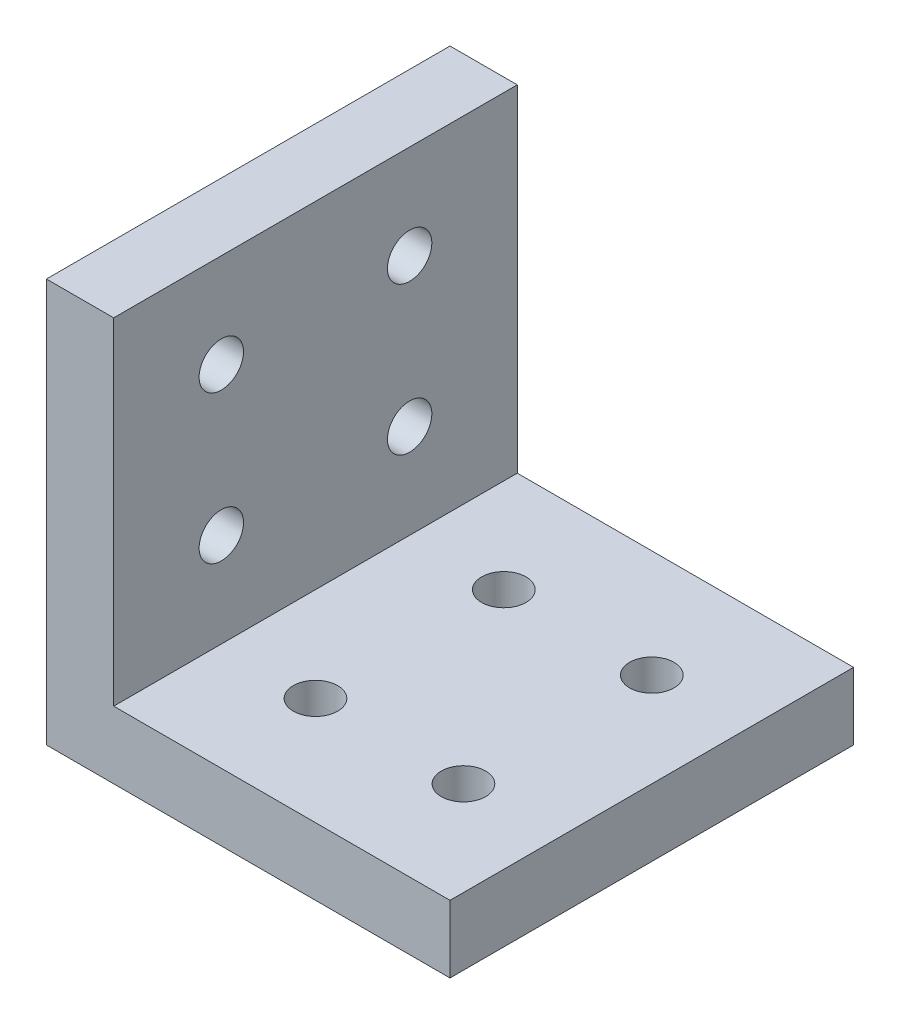
ISO-10303-21;
HEADER;
FILE_DESCRIPTION(('STEP AP214'),'2;1');
FILE_NAME('part.step','',(''),(''),'','','');
FILE_SCHEMA(('AUTOMOTIVE_DESIGN { 1 0 10303 214 1 1 1 1 }'));
ENDSEC;
DATA;
#1=APPLICATION_CONTEXT('core data for automotive mechanical design processes');
#2=APPLICATION_PROTOCOL_DEFINITION('international standard','automotive_design',2000,#1);
#3=PRODUCT_CONTEXT('',#1,'mechanical');
#4=PRODUCT('Part','Part','',(#3));
#5=PRODUCT_RELATED_PRODUCT_CATEGORY('part','',(#4));
#6=PRODUCT_DEFINITION_FORMATION('','',#4);
#7=PRODUCT_DEFINITION_CONTEXT('part definition',#1,'design');
#8=PRODUCT_DEFINITION('design','',#6,#7);
#9=PRODUCT_DEFINITION_SHAPE('','',#8);
#10=(LENGTH_UNIT() NAMED_UNIT(*) SI_UNIT(.MILLI.,.METRE.));
#11=(NAMED_UNIT(*) PLANE_ANGLE_UNIT() SI_UNIT($,.RADIAN.));
#12=(NAMED_UNIT(*) SI_UNIT($,.STERADIAN.) SOLID_ANGLE_UNIT());
#13=UNCERTAINTY_MEASURE_WITH_UNIT(LENGTH_MEASURE(1.E-05),#10,'distance_accuracy_value','');
#14=(GEOMETRIC_REPRESENTATION_CONTEXT(3) GLOBAL_UNCERTAINTY_ASSIGNED_CONTEXT((#13)) GLOBAL_UNIT_ASSIGNED_CONTEXT((#10,
#11,#12)) REPRESENTATION_CONTEXT('',''));
#15=CARTESIAN_POINT('',(0.,0.,0.));
#16=DIRECTION('',(0.,0.,1.));
#17=DIRECTION('',(1.,0.,0.));
#18=AXIS2_PLACEMENT_3D('',#15,#16,#17);
#19=CARTESIAN_POINT('',(5.,30.,30.));
#20=DIRECTION('',(0.,-1.,0.));
#21=DIRECTION('',(0.,0.,-1.));
#22=AXIS2_PLACEMENT_3D('',#19,#20,#21);
#23=PLANE('',#22);
#24=DIRECTION('',(-1.,0.,0.));
#25=VECTOR('',#24,1.);
#26=CARTESIAN_POINT('',(5.,30.,0.));
#27=LINE('',#26,#25);
#28=CARTESIAN_POINT('',(5.,30.,0.));
#29=VERTEX_POINT('',#28);
#30=CARTESIAN_POINT('',(0.,30.,0.));
#31=VERTEX_POINT('',#30);
#32=EDGE_CURVE('E119',#29,#31,#27,.T.);
#33=ORIENTED_EDGE('',*,*,#32,.T.);
#34=DIRECTION('',(0.,0.,-1.));
#35=VECTOR('',#34,1.);
#36=CARTESIAN_POINT('',(0.,30.,30.));
#37=LINE('',#36,#35);
#38=CARTESIAN_POINT('',(0.,30.,30.));
#39=VERTEX_POINT('',#38);
#40=EDGE_CURVE('E11',#39,#31,#37,.T.);
#41=ORIENTED_EDGE('',*,*,#40,.F.);
#42=DIRECTION('',(-1.,0.,0.));
#43=VECTOR('',#42,1.);
#44=CARTESIAN_POINT('',(5.,30.,30.));
#45=LINE('',#44,#43);
#46=CARTESIAN_POINT('',(5.,30.,30.));
#47=VERTEX_POINT('',#46);
#48=EDGE_CURVE('E130',#47,#39,#45,.T.);
#49=ORIENTED_EDGE('',*,*,#48,.F.);
#50=DIRECTION('',(0.,0.,-1.));
#51=VECTOR('',#50,1.);
#52=CARTESIAN_POINT('',(5.,30.,30.));
#53=LINE('',#52,#51);
#54=EDGE_CURVE('E115',#47,#29,#53,.T.);
#55=ORIENTED_EDGE('',*,*,#54,.T.);
#56=EDGE_LOOP('',(#33,#41,#49,#55));
#57=FACE_BOUND('',#56,.T.);
#58=ADVANCED_FACE('F35',(#57),#23,.F.);
#59=CARTESIAN_POINT('',(0.,30.,30.));
#60=DIRECTION('',(1.,0.,0.));
#61=DIRECTION('',(0.,0.,-1.));
#62=AXIS2_PLACEMENT_3D('',#59,#60,#61);
#63=PLANE('',#62);
#64=CARTESIAN_POINT('',(0.,12.,22.));
#65=DIRECTION('',(1.,0.,0.));
#66=DIRECTION('',(0.,0.,-1.));
#67=AXIS2_PLACEMENT_3D('',#64,#65,#66);
#68=CIRCLE('',#67,1.65);
#69=CARTESIAN_POINT('',(0.,12.,20.35));
#70=VERTEX_POINT('',#69);
#71=EDGE_CURVE('E292',#70,#70,#68,.T.);
#72=ORIENTED_EDGE('',*,*,#71,.T.);
#73=EDGE_LOOP('',(#72));
#74=FACE_BOUND('',#73,.T.);
#75=CARTESIAN_POINT('',(0.,23.,8.));
#76=DIRECTION('',(1.,0.,0.));
#77=DIRECTION('',(0.,0.,-1.));
#78=AXIS2_PLACEMENT_3D('',#75,#76,#77);
#79=CIRCLE('',#78,1.65);
#80=CARTESIAN_POINT('',(0.,23.,6.35));
#81=VERTEX_POINT('',#80);
#82=EDGE_CURVE('E294',#81,#81,#79,.T.);
#83=ORIENTED_EDGE('',*,*,#82,.T.);
#84=EDGE_LOOP('',(#83));
#85=FACE_BOUND('',#84,.T.);
#86=CARTESIAN_POINT('',(0.,12.,8.));
#87=DIRECTION('',(1.,0.,0.));
#88=DIRECTION('',(0.,0.,-1.));
#89=AXIS2_PLACEMENT_3D('',#86,#87,#88);
#90=CIRCLE('',#89,1.65);
#91=CARTESIAN_POINT('',(0.,12.,6.35));
#92=VERTEX_POINT('',#91);
#93=EDGE_CURVE('E300',#92,#92,#90,.T.);
#94=ORIENTED_EDGE('',*,*,#93,.T.);
#95=EDGE_LOOP('',(#94));
#96=FACE_BOUND('',#95,.T.);
#97=CARTESIAN_POINT('',(0.,23.,22.));
#98=DIRECTION('',(1.,0.,0.));
#99=DIRECTION('',(0.,0.,-1.));
#100=AXIS2_PLACEMENT_3D('',#97,#98,#99);
#101=CIRCLE('',#100,1.65);
#102=CARTESIAN_POINT('',(0.,23.,20.35));
#103=VERTEX_POINT('',#102);
#104=EDGE_CURVE('E344',#103,#103,#101,.T.);
#105=ORIENTED_EDGE('',*,*,#104,.T.);
#106=EDGE_LOOP('',(#105));
#107=FACE_BOUND('',#106,.T.);
#108=DIRECTION('',(0.,-1.,0.));
#109=VECTOR('',#108,1.);
#110=CARTESIAN_POINT('',(0.,30.,0.));
#111=LINE('',#110,#109);
#112=CARTESIAN_POINT('',(0.,0.,0.));
#113=VERTEX_POINT('',#112);
#114=EDGE_CURVE('E122',#31,#113,#111,.T.);
#115=ORIENTED_EDGE('',*,*,#114,.T.);
#116=DIRECTION('',(0.,0.,-1.));
#117=VECTOR('',#116,1.);
#118=CARTESIAN_POINT('',(0.,0.,30.));
#119=LINE('',#118,#117);
#120=CARTESIAN_POINT('',(0.,0.,30.));
#121=VERTEX_POINT('',#120);
#122=EDGE_CURVE('E43',#121,#113,#119,.T.);
#123=ORIENTED_EDGE('',*,*,#122,.F.);
#124=DIRECTION('',(0.,-1.,0.));
#125=VECTOR('',#124,1.);
#126=CARTESIAN_POINT('',(0.,30.,30.));
#127=LINE('',#126,#125);
#128=EDGE_CURVE('E88',#39,#121,#127,.T.);
#129=ORIENTED_EDGE('',*,*,#128,.F.);
#130=ORIENTED_EDGE('',*,*,#40,.T.);
#131=EDGE_LOOP('',(#115,#123,#129,#130));
#132=FACE_BOUND('',#131,.T.);
#133=ADVANCED_FACE('F158',(#74,#85,#96,#107,#132),#63,.F.);
#134=CARTESIAN_POINT('',(0.,0.,30.));
#135=DIRECTION('',(0.,1.,0.));
#136=DIRECTION('',(0.,0.,1.));
#137=AXIS2_PLACEMENT_3D('',#134,#135,#136);
#138=PLANE('',#137);
#139=CARTESIAN_POINT('',(23.,0.,22.));
#140=DIRECTION('',(0.,1.,0.));
#141=DIRECTION('',(0.,0.,1.));
#142=AXIS2_PLACEMENT_3D('',#139,#140,#141);
#143=CIRCLE('',#142,1.65);
#144=CARTESIAN_POINT('',(23.,0.,23.65));
#145=VERTEX_POINT('',#144);
#146=EDGE_CURVE('E123',#145,#145,#143,.T.);
#147=ORIENTED_EDGE('',*,*,#146,.T.);
#148=EDGE_LOOP('',(#147));
#149=FACE_BOUND('',#148,.T.);
#150=CARTESIAN_POINT('',(12.,0.,8.));
#151=DIRECTION('',(0.,1.,0.));
#152=DIRECTION('',(0.,0.,1.));
#153=AXIS2_PLACEMENT_3D('',#150,#151,#152);
#154=CIRCLE('',#153,1.65);
#155=CARTESIAN_POINT('',(12.,0.,9.65));
#156=VERTEX_POINT('',#155);
#157=EDGE_CURVE('E318',#156,#156,#154,.T.);
#158=ORIENTED_EDGE('',*,*,#157,.T.);
#159=EDGE_LOOP('',(#158));
#160=FACE_BOUND('',#159,.T.);
#161=CARTESIAN_POINT('',(12.,0.,22.));
#162=DIRECTION('',(0.,1.,0.));
#163=DIRECTION('',(0.,0.,1.));
#164=AXIS2_PLACEMENT_3D('',#161,#162,#163);
#165=CIRCLE('',#164,1.65);
#166=CARTESIAN_POINT('',(12.,0.,23.65));
#167=VERTEX_POINT('',#166);
#168=EDGE_CURVE('E315',#167,#167,#165,.T.);
#169=ORIENTED_EDGE('',*,*,#168,.T.);
#170=EDGE_LOOP('',(#169));
#171=FACE_BOUND('',#170,.T.);
#172=CARTESIAN_POINT('',(23.,0.,8.));
#173=DIRECTION('',(0.,1.,0.));
#174=DIRECTION('',(0.,0.,1.));
#175=AXIS2_PLACEMENT_3D('',#172,#173,#174);
#176=CIRCLE('',#175,1.65);
#177=CARTESIAN_POINT('',(23.,0.,9.65));
#178=VERTEX_POINT('',#177);
#179=EDGE_CURVE('E312',#178,#178,#176,.T.);
#180=ORIENTED_EDGE('',*,*,#179,.T.);
#181=EDGE_LOOP('',(#180));
#182=FACE_BOUND('',#181,.T.);
#183=DIRECTION('',(1.,0.,0.));
#184=VECTOR('',#183,1.);
#185=CARTESIAN_POINT('',(0.,0.,0.));
#186=LINE('',#185,#184);
#187=CARTESIAN_POINT('',(30.,0.,0.));
#188=VERTEX_POINT('',#187);
#189=EDGE_CURVE('E125',#113,#188,#186,.T.);
#190=ORIENTED_EDGE('',*,*,#189,.T.);
#191=DIRECTION('',(0.,0.,-1.));
#192=VECTOR('',#191,1.);
#193=CARTESIAN_POINT('',(30.,0.,30.));
#194=LINE('',#193,#192);
#195=CARTESIAN_POINT('',(30.,0.,30.));
#196=VERTEX_POINT('',#195);
#197=EDGE_CURVE('E110',#196,#188,#194,.T.);
#198=ORIENTED_EDGE('',*,*,#197,.F.);
#199=DIRECTION('',(1.,0.,0.));
#200=VECTOR('',#199,1.);
#201=CARTESIAN_POINT('',(0.,0.,30.));
#202=LINE('',#201,#200);
#203=EDGE_CURVE('E101',#121,#196,#202,.T.);
#204=ORIENTED_EDGE('',*,*,#203,.F.);
#205=ORIENTED_EDGE('',*,*,#122,.T.);
#206=EDGE_LOOP('',(#190,#198,#204,#205));
#207=FACE_BOUND('',#206,.T.);
#208=ADVANCED_FACE('F136',(#149,#160,#171,#182,#207),#138,.F.);
#209=CARTESIAN_POINT('',(30.,0.,30.));
#210=DIRECTION('',(-1.,0.,0.));
#211=DIRECTION('',(0.,0.,1.));
#212=AXIS2_PLACEMENT_3D('',#209,#210,#211);
#213=PLANE('',#212);
#214=DIRECTION('',(0.,1.,0.));
#215=VECTOR('',#214,1.);
#216=CARTESIAN_POINT('',(30.,0.,0.));
#217=LINE('',#216,#215);
#218=CARTESIAN_POINT('',(30.,5.,0.));
#219=VERTEX_POINT('',#218);
#220=EDGE_CURVE('E109',#188,#219,#217,.T.);
#221=ORIENTED_EDGE('',*,*,#220,.T.);
#222=DIRECTION('',(0.,0.,-1.));
#223=VECTOR('',#222,1.);
#224=CARTESIAN_POINT('',(30.,5.,30.));
#225=LINE('',#224,#223);
#226=CARTESIAN_POINT('',(30.,5.,30.));
#227=VERTEX_POINT('',#226);
#228=EDGE_CURVE('E106',#227,#219,#225,.T.);
#229=ORIENTED_EDGE('',*,*,#228,.F.);
#230=DIRECTION('',(0.,1.,0.));
#231=VECTOR('',#230,1.);
#232=CARTESIAN_POINT('',(30.,0.,30.));
#233=LINE('',#232,#231);
#234=EDGE_CURVE('E95',#196,#227,#233,.T.);
#235=ORIENTED_EDGE('',*,*,#234,.F.);
#236=ORIENTED_EDGE('',*,*,#197,.T.);
#237=EDGE_LOOP('',(#221,#229,#235,#236));
#238=FACE_BOUND('',#237,.T.);
#239=ADVANCED_FACE('F107',(#238),#213,.F.);
#240=CARTESIAN_POINT('',(30.,5.,30.));
#241=DIRECTION('',(0.,-1.,0.));
#242=DIRECTION('',(1.,0.,0.));
#243=AXIS2_PLACEMENT_3D('',#240,#241,#242);
#244=PLANE('',#243);
#245=CARTESIAN_POINT('',(23.,5.,22.));
#246=DIRECTION('',(0.,1.,0.));
#247=DIRECTION('',(-1.,0.,0.));
#248=AXIS2_PLACEMENT_3D('',#245,#246,#247);
#249=CIRCLE('',#248,1.65);
#250=CARTESIAN_POINT('',(21.35,5.,22.));
#251=VERTEX_POINT('',#250);
#252=EDGE_CURVE('E304',#251,#251,#249,.T.);
#253=ORIENTED_EDGE('',*,*,#252,.F.);
#254=EDGE_LOOP('',(#253));
#255=FACE_BOUND('',#254,.T.);
#256=CARTESIAN_POINT('',(12.,5.,8.));
#257=DIRECTION('',(0.,1.,0.));
#258=DIRECTION('',(-1.,0.,0.));
#259=AXIS2_PLACEMENT_3D('',#256,#257,#258);
#260=CIRCLE('',#259,1.65);
#261=CARTESIAN_POINT('',(10.35,5.,8.));
#262=VERTEX_POINT('',#261);
#263=EDGE_CURVE('E297',#262,#262,#260,.T.);
#264=ORIENTED_EDGE('',*,*,#263,.F.);
#265=EDGE_LOOP('',(#264));
#266=FACE_BOUND('',#265,.T.);
#267=CARTESIAN_POINT('',(12.,5.,22.));
#268=DIRECTION('',(0.,1.,0.));
#269=DIRECTION('',(-1.,0.,0.));
#270=AXIS2_PLACEMENT_3D('',#267,#268,#269);
#271=CIRCLE('',#270,1.65);
#272=CARTESIAN_POINT('',(10.35,5.,22.));
#273=VERTEX_POINT('',#272);
#274=EDGE_CURVE('E293',#273,#273,#271,.T.);
#275=ORIENTED_EDGE('',*,*,#274,.F.);
#276=EDGE_LOOP('',(#275));
#277=FACE_BOUND('',#276,.T.);
#278=CARTESIAN_POINT('',(23.,5.,8.));
#279=DIRECTION('',(0.,1.,0.));
#280=DIRECTION('',(-1.,0.,0.));
#281=AXIS2_PLACEMENT_3D('',#278,#279,#280);
#282=CIRCLE('',#281,1.65);
#283=CARTESIAN_POINT('',(21.35,5.,8.));
#284=VERTEX_POINT('',#283);
#285=EDGE_CURVE('E307',#284,#284,#282,.T.);
#286=ORIENTED_EDGE('',*,*,#285,.F.);
#287=EDGE_LOOP('',(#286));
#288=FACE_BOUND('',#287,.T.);
#289=DIRECTION('',(-1.,0.,0.));
#290=VECTOR('',#289,1.);
#291=CARTESIAN_POINT('',(30.,5.,0.));
#292=LINE('',#291,#290);
#293=CARTESIAN_POINT('',(5.,5.,0.));
#294=VERTEX_POINT('',#293);
#295=EDGE_CURVE('E74',#219,#294,#292,.T.);
#296=ORIENTED_EDGE('',*,*,#295,.T.);
#297=DIRECTION('',(0.,0.,-1.));
#298=VECTOR('',#297,1.);
#299=CARTESIAN_POINT('',(5.,5.,30.));
#300=LINE('',#299,#298);
#301=CARTESIAN_POINT('',(5.,5.,30.));
#302=VERTEX_POINT('',#301);
#303=EDGE_CURVE('E111',#302,#294,#300,.T.);
#304=ORIENTED_EDGE('',*,*,#303,.F.);
#305=DIRECTION('',(-1.,0.,0.));
#306=VECTOR('',#305,1.);
#307=CARTESIAN_POINT('',(30.,5.,30.));
#308=LINE('',#307,#306);
#309=EDGE_CURVE('E99',#227,#302,#308,.T.);
#310=ORIENTED_EDGE('',*,*,#309,.F.);
#311=ORIENTED_EDGE('',*,*,#228,.T.);
#312=EDGE_LOOP('',(#296,#304,#310,#311));
#313=FACE_BOUND('',#312,.T.);
#314=ADVANCED_FACE('F113',(#255,#266,#277,#288,#313),#244,.F.);
#315=CARTESIAN_POINT('',(5.,5.,30.));
#316=DIRECTION('',(-1.,0.,0.));
#317=DIRECTION('',(0.,-1.,0.));
#318=AXIS2_PLACEMENT_3D('',#315,#316,#317);
#319=PLANE('',#318);
#320=CARTESIAN_POINT('',(5.,12.,22.));
#321=DIRECTION('',(1.,0.,0.));
#322=DIRECTION('',(0.,1.,0.));
#323=AXIS2_PLACEMENT_3D('',#320,#321,#322);
#324=CIRCLE('',#323,1.65);
#325=CARTESIAN_POINT('',(5.,13.65,22.));
#326=VERTEX_POINT('',#325);
#327=EDGE_CURVE('E290',#326,#326,#324,.T.);
#328=ORIENTED_EDGE('',*,*,#327,.F.);
#329=EDGE_LOOP('',(#328));
#330=FACE_BOUND('',#329,.T.);
#331=CARTESIAN_POINT('',(5.,23.,8.));
#332=DIRECTION('',(1.,0.,0.));
#333=DIRECTION('',(0.,1.,0.));
#334=AXIS2_PLACEMENT_3D('',#331,#332,#333);
#335=CIRCLE('',#334,1.65);
#336=CARTESIAN_POINT('',(5.,24.65,8.));
#337=VERTEX_POINT('',#336);
#338=EDGE_CURVE('E350',#337,#337,#335,.T.);
#339=ORIENTED_EDGE('',*,*,#338,.F.);
#340=EDGE_LOOP('',(#339));
#341=FACE_BOUND('',#340,.T.);
#342=CARTESIAN_POINT('',(5.,12.,8.));
#343=DIRECTION('',(1.,0.,0.));
#344=DIRECTION('',(0.,1.,0.));
#345=AXIS2_PLACEMENT_3D('',#342,#343,#344);
#346=CIRCLE('',#345,1.65);
#347=CARTESIAN_POINT('',(5.,13.65,8.));
#348=VERTEX_POINT('',#347);
#349=EDGE_CURVE('E353',#348,#348,#346,.T.);
#350=ORIENTED_EDGE('',*,*,#349,.F.);
#351=EDGE_LOOP('',(#350));
#352=FACE_BOUND('',#351,.T.);
#353=CARTESIAN_POINT('',(5.,23.,22.));
#354=DIRECTION('',(1.,0.,0.));
#355=DIRECTION('',(0.,1.,0.));
#356=AXIS2_PLACEMENT_3D('',#353,#354,#355);
#357=CIRCLE('',#356,1.65);
#358=CARTESIAN_POINT('',(5.,24.65,22.));
#359=VERTEX_POINT('',#358);
#360=EDGE_CURVE('E347',#359,#359,#357,.T.);
#361=ORIENTED_EDGE('',*,*,#360,.F.);
#362=EDGE_LOOP('',(#361));
#363=FACE_BOUND('',#362,.T.);
#364=DIRECTION('',(0.,1.,0.));
#365=VECTOR('',#364,1.);
#366=CARTESIAN_POINT('',(5.,5.,0.));
#367=LINE('',#366,#365);
#368=EDGE_CURVE('E80',#294,#29,#367,.T.);
#369=ORIENTED_EDGE('',*,*,#368,.T.);
#370=ORIENTED_EDGE('',*,*,#54,.F.);
#371=DIRECTION('',(0.,1.,0.));
#372=VECTOR('',#371,1.);
#373=CARTESIAN_POINT('',(5.,5.,30.));
#374=LINE('',#373,#372);
#375=EDGE_CURVE('E51',#302,#47,#374,.T.);
#376=ORIENTED_EDGE('',*,*,#375,.F.);
#377=ORIENTED_EDGE('',*,*,#303,.T.);
#378=EDGE_LOOP('',(#369,#370,#376,#377));
#379=FACE_BOUND('',#378,.T.);
#380=ADVANCED_FACE('F143',(#330,#341,#352,#363,#379),#319,.F.);
#381=CARTESIAN_POINT('',(0.,0.,30.));
#382=DIRECTION('',(0.,0.,1.));
#383=DIRECTION('',(1.,0.,0.));
#384=AXIS2_PLACEMENT_3D('',#381,#382,#383);
#385=PLANE('',#384);
#386=ORIENTED_EDGE('',*,*,#48,.T.);
#387=ORIENTED_EDGE('',*,*,#128,.T.);
#388=ORIENTED_EDGE('',*,*,#203,.T.);
#389=ORIENTED_EDGE('',*,*,#234,.T.);
#390=ORIENTED_EDGE('',*,*,#309,.T.);
#391=ORIENTED_EDGE('',*,*,#375,.T.);
#392=EDGE_LOOP('',(#386,#387,#388,#389,#390,#391));
#393=FACE_BOUND('',#392,.T.);
#394=ADVANCED_FACE('F97',(#393),#385,.T.);
#395=CARTESIAN_POINT('',(0.,0.,0.));
#396=DIRECTION('',(0.,0.,1.));
#397=DIRECTION('',(1.,0.,0.));
#398=AXIS2_PLACEMENT_3D('',#395,#396,#397);
#399=PLANE('',#398);
#400=ORIENTED_EDGE('',*,*,#32,.F.);
#401=ORIENTED_EDGE('',*,*,#368,.F.);
#402=ORIENTED_EDGE('',*,*,#295,.F.);
#403=ORIENTED_EDGE('',*,*,#220,.F.);
#404=ORIENTED_EDGE('',*,*,#189,.F.);
#405=ORIENTED_EDGE('',*,*,#114,.F.);
#406=EDGE_LOOP('',(#400,#401,#402,#403,#404,#405));
#407=FACE_BOUND('',#406,.T.);
#408=ADVANCED_FACE('F139',(#407),#399,.F.);
#409=CARTESIAN_POINT('',(23.,-35.,8.));
#410=DIRECTION('',(0.,1.,0.));
#411=DIRECTION('',(-1.,0.,0.));
#412=AXIS2_PLACEMENT_3D('',#409,#410,#411);
#413=CYLINDRICAL_SURFACE('',#412,1.65);
#414=ORIENTED_EDGE('',*,*,#285,.T.);
#415=EDGE_LOOP('',(#414));
#416=FACE_BOUND('',#415,.T.);
#417=ORIENTED_EDGE('',*,*,#179,.F.);
#418=EDGE_LOOP('',(#417));
#419=FACE_BOUND('',#418,.T.);
#420=ADVANCED_FACE('F190',(#416,#419),#413,.F.);
#421=CARTESIAN_POINT('',(12.,-35.,22.));
#422=DIRECTION('',(0.,1.,0.));
#423=DIRECTION('',(-1.,0.,0.));
#424=AXIS2_PLACEMENT_3D('',#421,#422,#423);
#425=CYLINDRICAL_SURFACE('',#424,1.65);
#426=ORIENTED_EDGE('',*,*,#274,.T.);
#427=EDGE_LOOP('',(#426));
#428=FACE_BOUND('',#427,.T.);
#429=ORIENTED_EDGE('',*,*,#168,.F.);
#430=EDGE_LOOP('',(#429));
#431=FACE_BOUND('',#430,.T.);
#432=ADVANCED_FACE('F195',(#428,#431),#425,.F.);
#433=CARTESIAN_POINT('',(12.,-35.,8.));
#434=DIRECTION('',(0.,1.,0.));
#435=DIRECTION('',(-1.,0.,0.));
#436=AXIS2_PLACEMENT_3D('',#433,#434,#435);
#437=CYLINDRICAL_SURFACE('',#436,1.65);
#438=ORIENTED_EDGE('',*,*,#263,.T.);
#439=EDGE_LOOP('',(#438));
#440=FACE_BOUND('',#439,.T.);
#441=ORIENTED_EDGE('',*,*,#157,.F.);
#442=EDGE_LOOP('',(#441));
#443=FACE_BOUND('',#442,.T.);
#444=ADVANCED_FACE('F207',(#440,#443),#437,.F.);
#445=CARTESIAN_POINT('',(23.,-35.,22.));
#446=DIRECTION('',(0.,1.,0.));
#447=DIRECTION('',(-1.,0.,0.));
#448=AXIS2_PLACEMENT_3D('',#445,#446,#447);
#449=CYLINDRICAL_SURFACE('',#448,1.65);
#450=ORIENTED_EDGE('',*,*,#252,.T.);
#451=EDGE_LOOP('',(#450));
#452=FACE_BOUND('',#451,.T.);
#453=ORIENTED_EDGE('',*,*,#146,.F.);
#454=EDGE_LOOP('',(#453));
#455=FACE_BOUND('',#454,.T.);
#456=ADVANCED_FACE('F217',(#452,#455),#449,.F.);
#457=CARTESIAN_POINT('',(-35.,23.,22.));
#458=DIRECTION('',(1.,0.,0.));
#459=DIRECTION('',(0.,1.,0.));
#460=AXIS2_PLACEMENT_3D('',#457,#458,#459);
#461=CYLINDRICAL_SURFACE('',#460,1.65);
#462=ORIENTED_EDGE('',*,*,#360,.T.);
#463=EDGE_LOOP('',(#462));
#464=FACE_BOUND('',#463,.T.);
#465=ORIENTED_EDGE('',*,*,#104,.F.);
#466=EDGE_LOOP('',(#465));
#467=FACE_BOUND('',#466,.T.);
#468=ADVANCED_FACE('F226',(#464,#467),#461,.F.);
#469=CARTESIAN_POINT('',(-35.,12.,8.));
#470=DIRECTION('',(1.,0.,0.));
#471=DIRECTION('',(0.,1.,0.));
#472=AXIS2_PLACEMENT_3D('',#469,#470,#471);
#473=CYLINDRICAL_SURFACE('',#472,1.65);
#474=ORIENTED_EDGE('',*,*,#349,.T.);
#475=EDGE_LOOP('',(#474));
#476=FACE_BOUND('',#475,.T.);
#477=ORIENTED_EDGE('',*,*,#93,.F.);
#478=EDGE_LOOP('',(#477));
#479=FACE_BOUND('',#478,.T.);
#480=ADVANCED_FACE('F246',(#476,#479),#473,.F.);
#481=CARTESIAN_POINT('',(-35.,23.,8.));
#482=DIRECTION('',(1.,0.,0.));
#483=DIRECTION('',(0.,1.,0.));
#484=AXIS2_PLACEMENT_3D('',#481,#482,#483);
#485=CYLINDRICAL_SURFACE('',#484,1.65);
#486=ORIENTED_EDGE('',*,*,#338,.T.);
#487=EDGE_LOOP('',(#486));
#488=FACE_BOUND('',#487,.T.);
#489=ORIENTED_EDGE('',*,*,#82,.F.);
#490=EDGE_LOOP('',(#489));
#491=FACE_BOUND('',#490,.T.);
#492=ADVANCED_FACE('F256',(#488,#491),#485,.F.);
#493=CARTESIAN_POINT('',(-35.,12.,22.));
#494=DIRECTION('',(1.,0.,0.));
#495=DIRECTION('',(0.,1.,0.));
#496=AXIS2_PLACEMENT_3D('',#493,#494,#495);
#497=CYLINDRICAL_SURFACE('',#496,1.65);
#498=ORIENTED_EDGE('',*,*,#327,.T.);
#499=EDGE_LOOP('',(#498));
#500=FACE_BOUND('',#499,.T.);
#501=ORIENTED_EDGE('',*,*,#71,.F.);
#502=EDGE_LOOP('',(#501));
#503=FACE_BOUND('',#502,.T.);
#504=ADVANCED_FACE('F266',(#500,#503),#497,.F.);
#505=CLOSED_SHELL('',(#58,#133,#208,#239,#314,#380,#394,#408,#420,#432,#444,#456,#468,#480,#492,#504));
#506=MANIFOLD_SOLID_BREP('B2',#505);
#507=ADVANCED_BREP_SHAPE_REPRESENTATION('',(#18,#506),#14);
#508=SHAPE_DEFINITION_REPRESENTATION(#9,#507);
ENDSEC;
END-ISO-10303-21;
